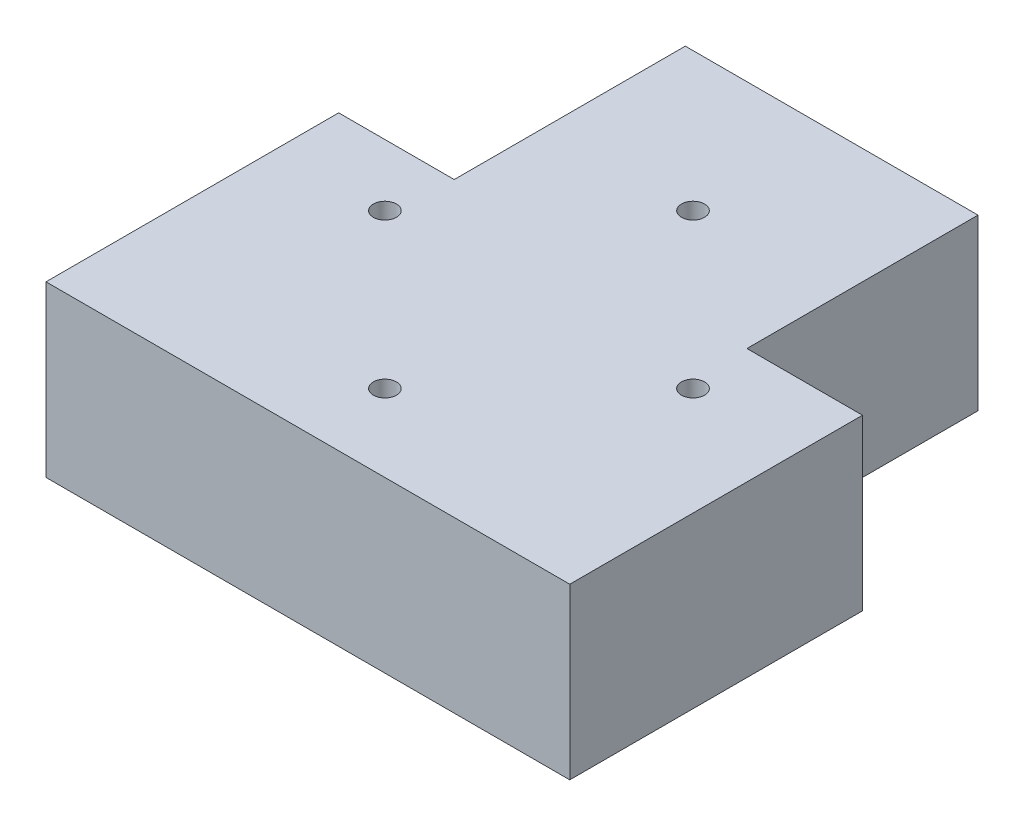
ISO-10303-21;
HEADER;
FILE_DESCRIPTION(('STEP AP214'),'2;1');
FILE_NAME('part.step','',(''),(''),'','','');
FILE_SCHEMA(('AUTOMOTIVE_DESIGN { 1 0 10303 214 1 1 1 1 }'));
ENDSEC;
DATA;
#1=APPLICATION_CONTEXT('core data for automotive mechanical design processes');
#2=APPLICATION_PROTOCOL_DEFINITION('international standard','automotive_design',2000,#1);
#3=PRODUCT_CONTEXT('',#1,'mechanical');
#4=PRODUCT('Part','Part','',(#3));
#5=PRODUCT_RELATED_PRODUCT_CATEGORY('part','',(#4));
#6=PRODUCT_DEFINITION_FORMATION('','',#4);
#7=PRODUCT_DEFINITION_CONTEXT('part definition',#1,'design');
#8=PRODUCT_DEFINITION('design','',#6,#7);
#9=PRODUCT_DEFINITION_SHAPE('','',#8);
#10=(LENGTH_UNIT() NAMED_UNIT(*) SI_UNIT(.MILLI.,.METRE.));
#11=(NAMED_UNIT(*) PLANE_ANGLE_UNIT() SI_UNIT($,.RADIAN.));
#12=(NAMED_UNIT(*) SI_UNIT($,.STERADIAN.) SOLID_ANGLE_UNIT());
#13=UNCERTAINTY_MEASURE_WITH_UNIT(LENGTH_MEASURE(1.E-05),#10,'distance_accuracy_value','');
#14=(GEOMETRIC_REPRESENTATION_CONTEXT(3) GLOBAL_UNCERTAINTY_ASSIGNED_CONTEXT((#13)) GLOBAL_UNIT_ASSIGNED_CONTEXT((#10,
#11,#12)) REPRESENTATION_CONTEXT('',''));
#15=CARTESIAN_POINT('',(0.,0.,0.));
#16=DIRECTION('',(0.,0.,1.));
#17=DIRECTION('',(1.,0.,0.));
#18=AXIS2_PLACEMENT_3D('',#15,#16,#17);
#19=CARTESIAN_POINT('',(-19.9999999999994,10.,5.6843418860808E-13));
#20=DIRECTION('',(0.,-1.,0.));
#21=DIRECTION('',(0.,0.,-1.));
#22=AXIS2_PLACEMENT_3D('',#19,#20,#21);
#23=CYLINDRICAL_SURFACE('',#22,1.5);
#24=CARTESIAN_POINT('',(-19.9999999999994,10.,5.6843418860808E-13));
#25=DIRECTION('',(0.,1.,0.));
#26=DIRECTION('',(0.,0.,1.));
#27=AXIS2_PLACEMENT_3D('',#24,#25,#26);
#28=CIRCLE('',#27,1.5);
#29=CARTESIAN_POINT('',(-19.9999999999994,10.,1.50000000000057));
#30=VERTEX_POINT('',#29);
#31=EDGE_CURVE('E182',#30,#30,#28,.T.);
#32=ORIENTED_EDGE('',*,*,#31,.T.);
#33=EDGE_LOOP('',(#32));
#34=FACE_BOUND('',#33,.T.);
#35=CARTESIAN_POINT('',(-19.9999999999994,7.,5.6843418860808E-13));
#36=DIRECTION('',(0.,-1.,0.));
#37=DIRECTION('',(0.,0.,-1.));
#38=AXIS2_PLACEMENT_3D('',#35,#36,#37);
#39=CIRCLE('',#38,1.5);
#40=CARTESIAN_POINT('',(-19.9999999999994,7.,-1.49999999999943));
#41=VERTEX_POINT('',#40);
#42=EDGE_CURVE('E45',#41,#41,#39,.T.);
#43=ORIENTED_EDGE('',*,*,#42,.T.);
#44=EDGE_LOOP('',(#43));
#45=FACE_BOUND('',#44,.T.);
#46=ADVANCED_FACE('F41',(#34,#45),#23,.F.);
#47=CARTESIAN_POINT('',(1.13196979001957E-12,10.,20.));
#48=DIRECTION('',(0.,-1.,0.));
#49=DIRECTION('',(0.,0.,-1.));
#50=AXIS2_PLACEMENT_3D('',#47,#48,#49);
#51=CYLINDRICAL_SURFACE('',#50,1.5);
#52=CARTESIAN_POINT('',(1.13196979001957E-12,10.,20.));
#53=DIRECTION('',(0.,1.,0.));
#54=DIRECTION('',(0.,0.,1.));
#55=AXIS2_PLACEMENT_3D('',#52,#53,#54);
#56=CIRCLE('',#55,1.5);
#57=CARTESIAN_POINT('',(1.13196979001957E-12,10.,21.5));
#58=VERTEX_POINT('',#57);
#59=EDGE_CURVE('E186',#58,#58,#56,.T.);
#60=ORIENTED_EDGE('',*,*,#59,.T.);
#61=EDGE_LOOP('',(#60));
#62=FACE_BOUND('',#61,.T.);
#63=CARTESIAN_POINT('',(1.13196979001957E-12,7.,20.));
#64=DIRECTION('',(0.,-1.,0.));
#65=DIRECTION('',(0.,0.,-1.));
#66=AXIS2_PLACEMENT_3D('',#63,#64,#65);
#67=CIRCLE('',#66,1.5);
#68=CARTESIAN_POINT('',(1.13196979001957E-12,7.,18.5));
#69=VERTEX_POINT('',#68);
#70=EDGE_CURVE('E338',#69,#69,#67,.T.);
#71=ORIENTED_EDGE('',*,*,#70,.T.);
#72=EDGE_LOOP('',(#71));
#73=FACE_BOUND('',#72,.T.);
#74=ADVANCED_FACE('F364',(#62,#73),#51,.F.);
#75=CARTESIAN_POINT('',(20.0000000000006,10.,-5.65984895009786E-13));
#76=DIRECTION('',(0.,-1.,0.));
#77=DIRECTION('',(0.,0.,-1.));
#78=AXIS2_PLACEMENT_3D('',#75,#76,#77);
#79=CYLINDRICAL_SURFACE('',#78,1.5);
#80=CARTESIAN_POINT('',(20.0000000000006,10.,-5.65984895009786E-13));
#81=DIRECTION('',(0.,1.,0.));
#82=DIRECTION('',(0.,0.,1.));
#83=AXIS2_PLACEMENT_3D('',#80,#81,#82);
#84=CIRCLE('',#83,1.5);
#85=CARTESIAN_POINT('',(20.0000000000006,10.,1.49999999999943));
#86=VERTEX_POINT('',#85);
#87=EDGE_CURVE('E350',#86,#86,#84,.T.);
#88=ORIENTED_EDGE('',*,*,#87,.T.);
#89=EDGE_LOOP('',(#88));
#90=FACE_BOUND('',#89,.T.);
#91=CARTESIAN_POINT('',(20.0000000000006,7.,-5.65984895009786E-13));
#92=DIRECTION('',(0.,-1.,0.));
#93=DIRECTION('',(0.,0.,-1.));
#94=AXIS2_PLACEMENT_3D('',#91,#92,#93);
#95=CIRCLE('',#94,1.5);
#96=CARTESIAN_POINT('',(20.0000000000006,7.,-1.50000000000057));
#97=VERTEX_POINT('',#96);
#98=EDGE_CURVE('E334',#97,#97,#95,.T.);
#99=ORIENTED_EDGE('',*,*,#98,.T.);
#100=EDGE_LOOP('',(#99));
#101=FACE_BOUND('',#100,.T.);
#102=ADVANCED_FACE('F374',(#90,#101),#79,.F.);
#103=CARTESIAN_POINT('',(0.,10.,-20.));
#104=DIRECTION('',(0.,-1.,0.));
#105=DIRECTION('',(0.,0.,-1.));
#106=AXIS2_PLACEMENT_3D('',#103,#104,#105);
#107=CYLINDRICAL_SURFACE('',#106,1.5);
#108=CARTESIAN_POINT('',(0.,10.,-20.));
#109=DIRECTION('',(0.,1.,0.));
#110=DIRECTION('',(0.,0.,1.));
#111=AXIS2_PLACEMENT_3D('',#108,#109,#110);
#112=CIRCLE('',#111,1.5);
#113=CARTESIAN_POINT('',(0.,10.,-18.5));
#114=VERTEX_POINT('',#113);
#115=EDGE_CURVE('E345',#114,#114,#112,.T.);
#116=ORIENTED_EDGE('',*,*,#115,.T.);
#117=EDGE_LOOP('',(#116));
#118=FACE_BOUND('',#117,.T.);
#119=CARTESIAN_POINT('',(0.,7.,-20.));
#120=DIRECTION('',(0.,-1.,0.));
#121=DIRECTION('',(0.,0.,-1.));
#122=AXIS2_PLACEMENT_3D('',#119,#120,#121);
#123=CIRCLE('',#122,1.5);
#124=CARTESIAN_POINT('',(0.,7.,-21.5));
#125=VERTEX_POINT('',#124);
#126=EDGE_CURVE('E330',#125,#125,#123,.T.);
#127=ORIENTED_EDGE('',*,*,#126,.T.);
#128=EDGE_LOOP('',(#127));
#129=FACE_BOUND('',#128,.T.);
#130=ADVANCED_FACE('F377',(#118,#129),#107,.F.);
#131=CARTESIAN_POINT('',(34.,0.,30.));
#132=DIRECTION('',(1.,0.,0.));
#133=DIRECTION('',(0.,0.,-1.));
#134=AXIS2_PLACEMENT_3D('',#131,#132,#133);
#135=PLANE('',#134);
#136=DIRECTION('',(0.,1.,0.));
#137=VECTOR('',#136,1.);
#138=CARTESIAN_POINT('',(34.,-12.,-8.));
#139=LINE('',#138,#137);
#140=CARTESIAN_POINT('',(34.,-12.,-8.));
#141=VERTEX_POINT('',#140);
#142=CARTESIAN_POINT('',(34.,10.,-8.));
#143=VERTEX_POINT('',#142);
#144=EDGE_CURVE('E168',#141,#143,#139,.T.);
#145=ORIENTED_EDGE('',*,*,#144,.T.);
#146=DIRECTION('',(0.,0.,-1.));
#147=VECTOR('',#146,1.);
#148=CARTESIAN_POINT('',(34.,10.,-8.));
#149=LINE('',#148,#147);
#150=CARTESIAN_POINT('',(34.,10.,30.));
#151=VERTEX_POINT('',#150);
#152=EDGE_CURVE('E165',#151,#143,#149,.T.);
#153=ORIENTED_EDGE('',*,*,#152,.F.);
#154=DIRECTION('',(0.,1.,0.));
#155=VECTOR('',#154,1.);
#156=CARTESIAN_POINT('',(34.,0.,30.));
#157=LINE('',#156,#155);
#158=CARTESIAN_POINT('',(34.,-12.,30.));
#159=VERTEX_POINT('',#158);
#160=EDGE_CURVE('E11',#159,#151,#157,.T.);
#161=ORIENTED_EDGE('',*,*,#160,.F.);
#162=DIRECTION('',(0.,0.,1.));
#163=VECTOR('',#162,1.);
#164=CARTESIAN_POINT('',(34.,-12.,-8.));
#165=LINE('',#164,#163);
#166=EDGE_CURVE('E308',#141,#159,#165,.T.);
#167=ORIENTED_EDGE('',*,*,#166,.F.);
#168=EDGE_LOOP('',(#145,#153,#161,#167));
#169=FACE_BOUND('',#168,.T.);
#170=ADVANCED_FACE('F166',(#169),#135,.T.);
#171=CARTESIAN_POINT('',(-34.,0.,30.));
#172=DIRECTION('',(-1.,0.,0.));
#173=DIRECTION('',(0.,0.,1.));
#174=AXIS2_PLACEMENT_3D('',#171,#172,#173);
#175=PLANE('',#174);
#176=DIRECTION('',(0.,1.,0.));
#177=VECTOR('',#176,1.);
#178=CARTESIAN_POINT('',(-34.,0.,30.));
#179=LINE('',#178,#177);
#180=CARTESIAN_POINT('',(-34.,-12.,30.));
#181=VERTEX_POINT('',#180);
#182=CARTESIAN_POINT('',(-34.,10.,30.));
#183=VERTEX_POINT('',#182);
#184=EDGE_CURVE('E51',#181,#183,#179,.T.);
#185=ORIENTED_EDGE('',*,*,#184,.T.);
#186=DIRECTION('',(0.,0.,1.));
#187=VECTOR('',#186,1.);
#188=CARTESIAN_POINT('',(-34.,10.,30.));
#189=LINE('',#188,#187);
#190=CARTESIAN_POINT('',(-34.,10.,-8.));
#191=VERTEX_POINT('',#190);
#192=EDGE_CURVE('E180',#191,#183,#189,.T.);
#193=ORIENTED_EDGE('',*,*,#192,.F.);
#194=DIRECTION('',(0.,1.,0.));
#195=VECTOR('',#194,1.);
#196=CARTESIAN_POINT('',(-34.,-12.,-8.));
#197=LINE('',#196,#195);
#198=CARTESIAN_POINT('',(-34.,-12.,-8.));
#199=VERTEX_POINT('',#198);
#200=EDGE_CURVE('E325',#199,#191,#197,.T.);
#201=ORIENTED_EDGE('',*,*,#200,.F.);
#202=DIRECTION('',(0.,0.,-1.));
#203=VECTOR('',#202,1.);
#204=CARTESIAN_POINT('',(-34.,-12.,30.));
#205=LINE('',#204,#203);
#206=EDGE_CURVE('E290',#181,#199,#205,.T.);
#207=ORIENTED_EDGE('',*,*,#206,.F.);
#208=EDGE_LOOP('',(#185,#193,#201,#207));
#209=FACE_BOUND('',#208,.T.);
#210=ADVANCED_FACE('F43',(#209),#175,.T.);
#211=CARTESIAN_POINT('',(-34.,0.,30.));
#212=DIRECTION('',(0.,0.,1.));
#213=DIRECTION('',(1.,0.,0.));
#214=AXIS2_PLACEMENT_3D('',#211,#212,#213);
#215=PLANE('',#214);
#216=ORIENTED_EDGE('',*,*,#184,.F.);
#217=DIRECTION('',(-1.,0.,0.));
#218=VECTOR('',#217,1.);
#219=CARTESIAN_POINT('',(34.,-12.,30.));
#220=LINE('',#219,#218);
#221=EDGE_CURVE('E160',#159,#181,#220,.T.);
#222=ORIENTED_EDGE('',*,*,#221,.F.);
#223=ORIENTED_EDGE('',*,*,#160,.T.);
#224=DIRECTION('',(1.,0.,0.));
#225=VECTOR('',#224,1.);
#226=CARTESIAN_POINT('',(34.,10.,30.));
#227=LINE('',#226,#225);
#228=EDGE_CURVE('E158',#183,#151,#227,.T.);
#229=ORIENTED_EDGE('',*,*,#228,.F.);
#230=EDGE_LOOP('',(#216,#222,#223,#229));
#231=FACE_BOUND('',#230,.T.);
#232=ADVANCED_FACE('F156',(#231),#215,.T.);
#233=CARTESIAN_POINT('',(-49.1041901155319,0.,-38.));
#234=DIRECTION('',(0.,0.,1.));
#235=DIRECTION('',(1.,0.,0.));
#236=AXIS2_PLACEMENT_3D('',#233,#234,#235);
#237=PLANE('',#236);
#238=DIRECTION('',(0.,1.,0.));
#239=VECTOR('',#238,1.);
#240=CARTESIAN_POINT('',(-19.,-12.,-38.));
#241=LINE('',#240,#239);
#242=CARTESIAN_POINT('',(-19.,-12.,-38.));
#243=VERTEX_POINT('',#242);
#244=CARTESIAN_POINT('',(-19.,10.,-38.));
#245=VERTEX_POINT('',#244);
#246=EDGE_CURVE('E319',#243,#245,#241,.T.);
#247=ORIENTED_EDGE('',*,*,#246,.T.);
#248=DIRECTION('',(-1.,0.,0.));
#249=VECTOR('',#248,1.);
#250=CARTESIAN_POINT('',(-19.,10.,-38.));
#251=LINE('',#250,#249);
#252=CARTESIAN_POINT('',(19.,10.,-38.));
#253=VERTEX_POINT('',#252);
#254=EDGE_CURVE('E196',#253,#245,#251,.T.);
#255=ORIENTED_EDGE('',*,*,#254,.F.);
#256=DIRECTION('',(0.,1.,0.));
#257=VECTOR('',#256,1.);
#258=CARTESIAN_POINT('',(19.,-12.,-38.));
#259=LINE('',#258,#257);
#260=CARTESIAN_POINT('',(19.,-12.,-38.));
#261=VERTEX_POINT('',#260);
#262=EDGE_CURVE('E316',#261,#253,#259,.T.);
#263=ORIENTED_EDGE('',*,*,#262,.F.);
#264=DIRECTION('',(1.,0.,0.));
#265=VECTOR('',#264,1.);
#266=CARTESIAN_POINT('',(-19.,-12.,-38.));
#267=LINE('',#266,#265);
#268=EDGE_CURVE('E299',#243,#261,#267,.T.);
#269=ORIENTED_EDGE('',*,*,#268,.F.);
#270=EDGE_LOOP('',(#247,#255,#263,#269));
#271=FACE_BOUND('',#270,.T.);
#272=ADVANCED_FACE('F425',(#271),#237,.F.);
#273=CARTESIAN_POINT('',(56.,3.,-38.));
#274=DIRECTION('',(0.,1.,0.));
#275=DIRECTION('',(0.,0.,1.));
#276=AXIS2_PLACEMENT_3D('',#273,#274,#275);
#277=PLANE('',#276);
#278=CARTESIAN_POINT('',(1.13196979001957E-12,3.,20.));
#279=DIRECTION('',(0.,-1.,0.));
#280=DIRECTION('',(0.,0.,-1.));
#281=AXIS2_PLACEMENT_3D('',#278,#279,#280);
#282=CIRCLE('',#281,2.75);
#283=CARTESIAN_POINT('',(1.13196979001957E-12,3.,17.25));
#284=VERTEX_POINT('',#283);
#285=EDGE_CURVE('E392',#284,#284,#282,.T.);
#286=ORIENTED_EDGE('',*,*,#285,.F.);
#287=EDGE_LOOP('',(#286));
#288=FACE_BOUND('',#287,.T.);
#289=CARTESIAN_POINT('',(20.0000000000006,3.,-5.65984895009786E-13));
#290=DIRECTION('',(0.,-1.,0.));
#291=DIRECTION('',(0.,0.,-1.));
#292=AXIS2_PLACEMENT_3D('',#289,#290,#291);
#293=CIRCLE('',#292,2.75);
#294=CARTESIAN_POINT('',(20.0000000000006,3.,-2.75000000000056));
#295=VERTEX_POINT('',#294);
#296=EDGE_CURVE('E393',#295,#295,#293,.T.);
#297=ORIENTED_EDGE('',*,*,#296,.F.);
#298=EDGE_LOOP('',(#297));
#299=FACE_BOUND('',#298,.T.);
#300=CARTESIAN_POINT('',(0.,3.,-20.));
#301=DIRECTION('',(0.,-1.,0.));
#302=DIRECTION('',(0.,0.,-1.));
#303=AXIS2_PLACEMENT_3D('',#300,#301,#302);
#304=CIRCLE('',#303,2.75);
#305=CARTESIAN_POINT('',(0.,3.,-22.75));
#306=VERTEX_POINT('',#305);
#307=EDGE_CURVE('E407',#306,#306,#304,.T.);
#308=ORIENTED_EDGE('',*,*,#307,.F.);
#309=EDGE_LOOP('',(#308));
#310=FACE_BOUND('',#309,.T.);
#311=CARTESIAN_POINT('',(-19.9999999999994,3.,5.6843418860808E-13));
#312=DIRECTION('',(0.,-1.,0.));
#313=DIRECTION('',(0.,0.,-1.));
#314=AXIS2_PLACEMENT_3D('',#311,#312,#313);
#315=CIRCLE('',#314,2.75);
#316=CARTESIAN_POINT('',(-19.9999999999994,3.,-2.74999999999943));
#317=VERTEX_POINT('',#316);
#318=EDGE_CURVE('E358',#317,#317,#315,.T.);
#319=ORIENTED_EDGE('',*,*,#318,.F.);
#320=EDGE_LOOP('',(#319));
#321=FACE_BOUND('',#320,.T.);
#322=DIRECTION('',(0.,0.,1.));
#323=VECTOR('',#322,1.);
#324=CARTESIAN_POINT('',(30.,3.,-4.));
#325=LINE('',#324,#323);
#326=CARTESIAN_POINT('',(30.,3.,-4.));
#327=VERTEX_POINT('',#326);
#328=CARTESIAN_POINT('',(30.,3.,26.));
#329=VERTEX_POINT('',#328);
#330=EDGE_CURVE('E214',#327,#329,#325,.T.);
#331=ORIENTED_EDGE('',*,*,#330,.T.);
#332=DIRECTION('',(-1.,0.,0.));
#333=VECTOR('',#332,1.);
#334=CARTESIAN_POINT('',(30.,3.,26.));
#335=LINE('',#334,#333);
#336=CARTESIAN_POINT('',(-30.,3.,26.));
#337=VERTEX_POINT('',#336);
#338=EDGE_CURVE('E209',#329,#337,#335,.T.);
#339=ORIENTED_EDGE('',*,*,#338,.T.);
#340=DIRECTION('',(0.,0.,-1.));
#341=VECTOR('',#340,1.);
#342=CARTESIAN_POINT('',(-30.,3.,26.));
#343=LINE('',#342,#341);
#344=CARTESIAN_POINT('',(-30.,3.,-3.99999999999999));
#345=VERTEX_POINT('',#344);
#346=EDGE_CURVE('E238',#337,#345,#343,.T.);
#347=ORIENTED_EDGE('',*,*,#346,.T.);
#348=DIRECTION('',(1.,0.,0.));
#349=VECTOR('',#348,1.);
#350=CARTESIAN_POINT('',(-30.,3.,-3.99999999999999));
#351=LINE('',#350,#349);
#352=CARTESIAN_POINT('',(-15.,3.,-3.99999999999999));
#353=VERTEX_POINT('',#352);
#354=EDGE_CURVE('E242',#345,#353,#351,.T.);
#355=ORIENTED_EDGE('',*,*,#354,.T.);
#356=DIRECTION('',(0.,0.,-1.));
#357=VECTOR('',#356,1.);
#358=CARTESIAN_POINT('',(-15.,3.,-3.99999999999999));
#359=LINE('',#358,#357);
#360=CARTESIAN_POINT('',(-15.,3.,-34.));
#361=VERTEX_POINT('',#360);
#362=EDGE_CURVE('E246',#353,#361,#359,.T.);
#363=ORIENTED_EDGE('',*,*,#362,.T.);
#364=DIRECTION('',(1.,0.,0.));
#365=VECTOR('',#364,1.);
#366=CARTESIAN_POINT('',(-15.,3.,-34.));
#367=LINE('',#366,#365);
#368=CARTESIAN_POINT('',(15.,3.,-34.));
#369=VERTEX_POINT('',#368);
#370=EDGE_CURVE('E250',#361,#369,#367,.T.);
#371=ORIENTED_EDGE('',*,*,#370,.T.);
#372=DIRECTION('',(0.,0.,1.));
#373=VECTOR('',#372,1.);
#374=CARTESIAN_POINT('',(15.,3.,-34.));
#375=LINE('',#374,#373);
#376=CARTESIAN_POINT('',(15.,3.,-4.));
#377=VERTEX_POINT('',#376);
#378=EDGE_CURVE('E254',#369,#377,#375,.T.);
#379=ORIENTED_EDGE('',*,*,#378,.T.);
#380=DIRECTION('',(1.,0.,0.));
#381=VECTOR('',#380,1.);
#382=CARTESIAN_POINT('',(15.,3.,-4.));
#383=LINE('',#382,#381);
#384=EDGE_CURVE('E258',#377,#327,#383,.T.);
#385=ORIENTED_EDGE('',*,*,#384,.T.);
#386=EDGE_LOOP('',(#331,#339,#347,#355,#363,#371,#379,#385));
#387=FACE_BOUND('',#386,.T.);
#388=ADVANCED_FACE('F421',(#288,#299,#310,#321,#387),#277,.F.);
#389=CARTESIAN_POINT('',(0.,-12.,0.));
#390=DIRECTION('',(0.,-1.,0.));
#391=DIRECTION('',(0.,0.,-1.));
#392=AXIS2_PLACEMENT_3D('',#389,#390,#391);
#393=PLANE('',#392);
#394=ORIENTED_EDGE('',*,*,#221,.T.);
#395=ORIENTED_EDGE('',*,*,#206,.T.);
#396=DIRECTION('',(1.,0.,0.));
#397=VECTOR('',#396,1.);
#398=CARTESIAN_POINT('',(-34.,-12.,-8.));
#399=LINE('',#398,#397);
#400=CARTESIAN_POINT('',(-19.,-12.,-8.));
#401=VERTEX_POINT('',#400);
#402=EDGE_CURVE('E293',#199,#401,#399,.T.);
#403=ORIENTED_EDGE('',*,*,#402,.T.);
#404=DIRECTION('',(0.,0.,-1.));
#405=VECTOR('',#404,1.);
#406=CARTESIAN_POINT('',(-19.,-12.,-8.));
#407=LINE('',#406,#405);
#408=EDGE_CURVE('E296',#401,#243,#407,.T.);
#409=ORIENTED_EDGE('',*,*,#408,.T.);
#410=ORIENTED_EDGE('',*,*,#268,.T.);
#411=DIRECTION('',(0.,0.,1.));
#412=VECTOR('',#411,1.);
#413=CARTESIAN_POINT('',(19.,-12.,-38.));
#414=LINE('',#413,#412);
#415=CARTESIAN_POINT('',(19.,-12.,-8.));
#416=VERTEX_POINT('',#415);
#417=EDGE_CURVE('E302',#261,#416,#414,.T.);
#418=ORIENTED_EDGE('',*,*,#417,.T.);
#419=DIRECTION('',(1.,0.,0.));
#420=VECTOR('',#419,1.);
#421=CARTESIAN_POINT('',(19.,-12.,-8.));
#422=LINE('',#421,#420);
#423=EDGE_CURVE('E305',#416,#141,#422,.T.);
#424=ORIENTED_EDGE('',*,*,#423,.T.);
#425=ORIENTED_EDGE('',*,*,#166,.T.);
#426=EDGE_LOOP('',(#394,#395,#403,#409,#410,#418,#424,#425));
#427=FACE_BOUND('',#426,.T.);
#428=DIRECTION('',(0.,0.,-1.));
#429=VECTOR('',#428,1.);
#430=CARTESIAN_POINT('',(-30.,-12.,26.));
#431=LINE('',#430,#429);
#432=CARTESIAN_POINT('',(-30.,-12.,26.));
#433=VERTEX_POINT('',#432);
#434=CARTESIAN_POINT('',(-30.,-12.,-3.99999999999999));
#435=VERTEX_POINT('',#434);
#436=EDGE_CURVE('E213',#433,#435,#431,.T.);
#437=ORIENTED_EDGE('',*,*,#436,.F.);
#438=DIRECTION('',(-1.,0.,0.));
#439=VECTOR('',#438,1.);
#440=CARTESIAN_POINT('',(30.,-12.,26.));
#441=LINE('',#440,#439);
#442=CARTESIAN_POINT('',(30.,-12.,26.));
#443=VERTEX_POINT('',#442);
#444=EDGE_CURVE('E210',#443,#433,#441,.T.);
#445=ORIENTED_EDGE('',*,*,#444,.F.);
#446=DIRECTION('',(0.,0.,1.));
#447=VECTOR('',#446,1.);
#448=CARTESIAN_POINT('',(30.,-12.,-4.));
#449=LINE('',#448,#447);
#450=CARTESIAN_POINT('',(30.,-12.,-4.));
#451=VERTEX_POINT('',#450);
#452=EDGE_CURVE('E232',#451,#443,#449,.T.);
#453=ORIENTED_EDGE('',*,*,#452,.F.);
#454=DIRECTION('',(1.,0.,0.));
#455=VECTOR('',#454,1.);
#456=CARTESIAN_POINT('',(15.,-12.,-4.));
#457=LINE('',#456,#455);
#458=CARTESIAN_POINT('',(15.,-12.,-4.));
#459=VERTEX_POINT('',#458);
#460=EDGE_CURVE('E229',#459,#451,#457,.T.);
#461=ORIENTED_EDGE('',*,*,#460,.F.);
#462=DIRECTION('',(0.,0.,1.));
#463=VECTOR('',#462,1.);
#464=CARTESIAN_POINT('',(15.,-12.,-34.));
#465=LINE('',#464,#463);
#466=CARTESIAN_POINT('',(15.,-12.,-34.));
#467=VERTEX_POINT('',#466);
#468=EDGE_CURVE('E226',#467,#459,#465,.T.);
#469=ORIENTED_EDGE('',*,*,#468,.F.);
#470=DIRECTION('',(1.,0.,0.));
#471=VECTOR('',#470,1.);
#472=CARTESIAN_POINT('',(-15.,-12.,-34.));
#473=LINE('',#472,#471);
#474=CARTESIAN_POINT('',(-15.,-12.,-34.));
#475=VERTEX_POINT('',#474);
#476=EDGE_CURVE('E223',#475,#467,#473,.T.);
#477=ORIENTED_EDGE('',*,*,#476,.F.);
#478=DIRECTION('',(0.,0.,-1.));
#479=VECTOR('',#478,1.);
#480=CARTESIAN_POINT('',(-15.,-12.,-3.99999999999999));
#481=LINE('',#480,#479);
#482=CARTESIAN_POINT('',(-15.,-12.,-3.99999999999999));
#483=VERTEX_POINT('',#482);
#484=EDGE_CURVE('E220',#483,#475,#481,.T.);
#485=ORIENTED_EDGE('',*,*,#484,.F.);
#486=DIRECTION('',(1.,0.,0.));
#487=VECTOR('',#486,1.);
#488=CARTESIAN_POINT('',(-30.,-12.,-3.99999999999999));
#489=LINE('',#488,#487);
#490=EDGE_CURVE('E217',#435,#483,#489,.T.);
#491=ORIENTED_EDGE('',*,*,#490,.F.);
#492=EDGE_LOOP('',(#437,#445,#453,#461,#469,#477,#485,#491));
#493=FACE_BOUND('',#492,.T.);
#494=ADVANCED_FACE('F424',(#427,#493),#393,.T.);
#495=CARTESIAN_POINT('',(-34.,-12.,-8.));
#496=DIRECTION('',(0.,0.,1.));
#497=DIRECTION('',(1.,0.,0.));
#498=AXIS2_PLACEMENT_3D('',#495,#496,#497);
#499=PLANE('',#498);
#500=ORIENTED_EDGE('',*,*,#200,.T.);
#501=DIRECTION('',(-1.,0.,0.));
#502=VECTOR('',#501,1.);
#503=CARTESIAN_POINT('',(-34.,10.,-8.));
#504=LINE('',#503,#502);
#505=CARTESIAN_POINT('',(-19.,10.,-8.));
#506=VERTEX_POINT('',#505);
#507=EDGE_CURVE('E204',#506,#191,#504,.T.);
#508=ORIENTED_EDGE('',*,*,#507,.F.);
#509=DIRECTION('',(0.,1.,0.));
#510=VECTOR('',#509,1.);
#511=CARTESIAN_POINT('',(-19.,-12.,-8.));
#512=LINE('',#511,#510);
#513=EDGE_CURVE('E322',#401,#506,#512,.T.);
#514=ORIENTED_EDGE('',*,*,#513,.F.);
#515=ORIENTED_EDGE('',*,*,#402,.F.);
#516=EDGE_LOOP('',(#500,#508,#514,#515));
#517=FACE_BOUND('',#516,.T.);
#518=ADVANCED_FACE('F587',(#517),#499,.F.);
#519=CARTESIAN_POINT('',(-19.,-12.,-8.));
#520=DIRECTION('',(1.,0.,0.));
#521=DIRECTION('',(0.,0.,-1.));
#522=AXIS2_PLACEMENT_3D('',#519,#520,#521);
#523=PLANE('',#522);
#524=ORIENTED_EDGE('',*,*,#513,.T.);
#525=DIRECTION('',(0.,0.,1.));
#526=VECTOR('',#525,1.);
#527=CARTESIAN_POINT('',(-19.,10.,-8.));
#528=LINE('',#527,#526);
#529=EDGE_CURVE('E200',#245,#506,#528,.T.);
#530=ORIENTED_EDGE('',*,*,#529,.F.);
#531=ORIENTED_EDGE('',*,*,#246,.F.);
#532=ORIENTED_EDGE('',*,*,#408,.F.);
#533=EDGE_LOOP('',(#524,#530,#531,#532));
#534=FACE_BOUND('',#533,.T.);
#535=ADVANCED_FACE('F574',(#534),#523,.F.);
#536=CARTESIAN_POINT('',(19.,-12.,-38.));
#537=DIRECTION('',(-1.,0.,0.));
#538=DIRECTION('',(0.,0.,1.));
#539=AXIS2_PLACEMENT_3D('',#536,#537,#538);
#540=PLANE('',#539);
#541=ORIENTED_EDGE('',*,*,#262,.T.);
#542=DIRECTION('',(0.,0.,-1.));
#543=VECTOR('',#542,1.);
#544=CARTESIAN_POINT('',(19.,10.,-38.));
#545=LINE('',#544,#543);
#546=CARTESIAN_POINT('',(19.,10.,-8.));
#547=VERTEX_POINT('',#546);
#548=EDGE_CURVE('E192',#547,#253,#545,.T.);
#549=ORIENTED_EDGE('',*,*,#548,.F.);
#550=DIRECTION('',(0.,1.,0.));
#551=VECTOR('',#550,1.);
#552=CARTESIAN_POINT('',(19.,-12.,-8.));
#553=LINE('',#552,#551);
#554=EDGE_CURVE('E313',#416,#547,#553,.T.);
#555=ORIENTED_EDGE('',*,*,#554,.F.);
#556=ORIENTED_EDGE('',*,*,#417,.F.);
#557=EDGE_LOOP('',(#541,#549,#555,#556));
#558=FACE_BOUND('',#557,.T.);
#559=ADVANCED_FACE('F560',(#558),#540,.F.);
#560=CARTESIAN_POINT('',(19.,-12.,-8.));
#561=DIRECTION('',(0.,0.,1.));
#562=DIRECTION('',(1.,0.,0.));
#563=AXIS2_PLACEMENT_3D('',#560,#561,#562);
#564=PLANE('',#563);
#565=ORIENTED_EDGE('',*,*,#554,.T.);
#566=DIRECTION('',(-1.,0.,0.));
#567=VECTOR('',#566,1.);
#568=CARTESIAN_POINT('',(19.,10.,-8.));
#569=LINE('',#568,#567);
#570=EDGE_CURVE('E173',#143,#547,#569,.T.);
#571=ORIENTED_EDGE('',*,*,#570,.F.);
#572=ORIENTED_EDGE('',*,*,#144,.F.);
#573=ORIENTED_EDGE('',*,*,#423,.F.);
#574=EDGE_LOOP('',(#565,#571,#572,#573));
#575=FACE_BOUND('',#574,.T.);
#576=ADVANCED_FACE('F553',(#575),#564,.F.);
#577=CARTESIAN_POINT('',(30.,-12.,26.));
#578=DIRECTION('',(0.,0.,-1.));
#579=DIRECTION('',(-1.,0.,0.));
#580=AXIS2_PLACEMENT_3D('',#577,#578,#579);
#581=PLANE('',#580);
#582=ORIENTED_EDGE('',*,*,#338,.F.);
#583=DIRECTION('',(0.,1.,0.));
#584=VECTOR('',#583,1.);
#585=CARTESIAN_POINT('',(30.,-12.,26.));
#586=LINE('',#585,#584);
#587=EDGE_CURVE('E59',#443,#329,#586,.T.);
#588=ORIENTED_EDGE('',*,*,#587,.F.);
#589=ORIENTED_EDGE('',*,*,#444,.T.);
#590=DIRECTION('',(0.,1.,0.));
#591=VECTOR('',#590,1.);
#592=CARTESIAN_POINT('',(-30.,-12.,26.));
#593=LINE('',#592,#591);
#594=EDGE_CURVE('E284',#433,#337,#593,.T.);
#595=ORIENTED_EDGE('',*,*,#594,.T.);
#596=EDGE_LOOP('',(#582,#588,#589,#595));
#597=FACE_BOUND('',#596,.T.);
#598=ADVANCED_FACE('F559',(#597),#581,.T.);
#599=CARTESIAN_POINT('',(-30.,-12.,26.));
#600=DIRECTION('',(1.,0.,0.));
#601=DIRECTION('',(0.,0.,-1.));
#602=AXIS2_PLACEMENT_3D('',#599,#600,#601);
#603=PLANE('',#602);
#604=ORIENTED_EDGE('',*,*,#346,.F.);
#605=ORIENTED_EDGE('',*,*,#594,.F.);
#606=ORIENTED_EDGE('',*,*,#436,.T.);
#607=DIRECTION('',(0.,1.,0.));
#608=VECTOR('',#607,1.);
#609=CARTESIAN_POINT('',(-30.,-12.,-3.99999999999999));
#610=LINE('',#609,#608);
#611=EDGE_CURVE('E281',#435,#345,#610,.T.);
#612=ORIENTED_EDGE('',*,*,#611,.T.);
#613=EDGE_LOOP('',(#604,#605,#606,#612));
#614=FACE_BOUND('',#613,.T.);
#615=ADVANCED_FACE('F696',(#614),#603,.T.);
#616=CARTESIAN_POINT('',(-30.,-12.,-3.99999999999999));
#617=DIRECTION('',(0.,0.,1.));
#618=DIRECTION('',(1.,0.,0.));
#619=AXIS2_PLACEMENT_3D('',#616,#617,#618);
#620=PLANE('',#619);
#621=ORIENTED_EDGE('',*,*,#354,.F.);
#622=ORIENTED_EDGE('',*,*,#611,.F.);
#623=ORIENTED_EDGE('',*,*,#490,.T.);
#624=DIRECTION('',(0.,1.,0.));
#625=VECTOR('',#624,1.);
#626=CARTESIAN_POINT('',(-15.,-12.,-3.99999999999999));
#627=LINE('',#626,#625);
#628=EDGE_CURVE('E278',#483,#353,#627,.T.);
#629=ORIENTED_EDGE('',*,*,#628,.T.);
#630=EDGE_LOOP('',(#621,#622,#623,#629));
#631=FACE_BOUND('',#630,.T.);
#632=ADVANCED_FACE('F686',(#631),#620,.T.);
#633=CARTESIAN_POINT('',(-15.,-12.,-3.99999999999999));
#634=DIRECTION('',(1.,0.,0.));
#635=DIRECTION('',(0.,0.,-1.));
#636=AXIS2_PLACEMENT_3D('',#633,#634,#635);
#637=PLANE('',#636);
#638=ORIENTED_EDGE('',*,*,#362,.F.);
#639=ORIENTED_EDGE('',*,*,#628,.F.);
#640=ORIENTED_EDGE('',*,*,#484,.T.);
#641=DIRECTION('',(0.,1.,0.));
#642=VECTOR('',#641,1.);
#643=CARTESIAN_POINT('',(-15.,-12.,-34.));
#644=LINE('',#643,#642);
#645=EDGE_CURVE('E275',#475,#361,#644,.T.);
#646=ORIENTED_EDGE('',*,*,#645,.T.);
#647=EDGE_LOOP('',(#638,#639,#640,#646));
#648=FACE_BOUND('',#647,.T.);
#649=ADVANCED_FACE('F676',(#648),#637,.T.);
#650=CARTESIAN_POINT('',(-15.,-12.,-34.));
#651=DIRECTION('',(0.,0.,1.));
#652=DIRECTION('',(1.,0.,0.));
#653=AXIS2_PLACEMENT_3D('',#650,#651,#652);
#654=PLANE('',#653);
#655=ORIENTED_EDGE('',*,*,#370,.F.);
#656=ORIENTED_EDGE('',*,*,#645,.F.);
#657=ORIENTED_EDGE('',*,*,#476,.T.);
#658=DIRECTION('',(0.,1.,0.));
#659=VECTOR('',#658,1.);
#660=CARTESIAN_POINT('',(15.,-12.,-34.));
#661=LINE('',#660,#659);
#662=EDGE_CURVE('E272',#467,#369,#661,.T.);
#663=ORIENTED_EDGE('',*,*,#662,.T.);
#664=EDGE_LOOP('',(#655,#656,#657,#663));
#665=FACE_BOUND('',#664,.T.);
#666=ADVANCED_FACE('F666',(#665),#654,.T.);
#667=CARTESIAN_POINT('',(15.,-12.,-34.));
#668=DIRECTION('',(-1.,0.,0.));
#669=DIRECTION('',(0.,0.,1.));
#670=AXIS2_PLACEMENT_3D('',#667,#668,#669);
#671=PLANE('',#670);
#672=ORIENTED_EDGE('',*,*,#378,.F.);
#673=ORIENTED_EDGE('',*,*,#662,.F.);
#674=ORIENTED_EDGE('',*,*,#468,.T.);
#675=DIRECTION('',(0.,1.,0.));
#676=VECTOR('',#675,1.);
#677=CARTESIAN_POINT('',(15.,-12.,-4.));
#678=LINE('',#677,#676);
#679=EDGE_CURVE('E269',#459,#377,#678,.T.);
#680=ORIENTED_EDGE('',*,*,#679,.T.);
#681=EDGE_LOOP('',(#672,#673,#674,#680));
#682=FACE_BOUND('',#681,.T.);
#683=ADVANCED_FACE('F435',(#682),#671,.T.);
#684=CARTESIAN_POINT('',(15.,-12.,-4.));
#685=DIRECTION('',(0.,0.,1.));
#686=DIRECTION('',(1.,0.,0.));
#687=AXIS2_PLACEMENT_3D('',#684,#685,#686);
#688=PLANE('',#687);
#689=ORIENTED_EDGE('',*,*,#384,.F.);
#690=ORIENTED_EDGE('',*,*,#679,.F.);
#691=ORIENTED_EDGE('',*,*,#460,.T.);
#692=DIRECTION('',(0.,1.,0.));
#693=VECTOR('',#692,1.);
#694=CARTESIAN_POINT('',(30.,-12.,-4.));
#695=LINE('',#694,#693);
#696=EDGE_CURVE('E64',#451,#327,#695,.T.);
#697=ORIENTED_EDGE('',*,*,#696,.T.);
#698=EDGE_LOOP('',(#689,#690,#691,#697));
#699=FACE_BOUND('',#698,.T.);
#700=ADVANCED_FACE('F430',(#699),#688,.T.);
#701=CARTESIAN_POINT('',(30.,-12.,-4.));
#702=DIRECTION('',(-1.,0.,0.));
#703=DIRECTION('',(0.,0.,1.));
#704=AXIS2_PLACEMENT_3D('',#701,#702,#703);
#705=PLANE('',#704);
#706=ORIENTED_EDGE('',*,*,#330,.F.);
#707=ORIENTED_EDGE('',*,*,#696,.F.);
#708=ORIENTED_EDGE('',*,*,#452,.T.);
#709=ORIENTED_EDGE('',*,*,#587,.T.);
#710=EDGE_LOOP('',(#706,#707,#708,#709));
#711=FACE_BOUND('',#710,.T.);
#712=ADVANCED_FACE('F369',(#711),#705,.T.);
#713=CARTESIAN_POINT('',(0.,10.,0.));
#714=DIRECTION('',(0.,-1.,0.));
#715=DIRECTION('',(0.,0.,-1.));
#716=AXIS2_PLACEMENT_3D('',#713,#714,#715);
#717=PLANE('',#716);
#718=ORIENTED_EDGE('',*,*,#228,.T.);
#719=ORIENTED_EDGE('',*,*,#152,.T.);
#720=ORIENTED_EDGE('',*,*,#570,.T.);
#721=ORIENTED_EDGE('',*,*,#548,.T.);
#722=ORIENTED_EDGE('',*,*,#254,.T.);
#723=ORIENTED_EDGE('',*,*,#529,.T.);
#724=ORIENTED_EDGE('',*,*,#507,.T.);
#725=ORIENTED_EDGE('',*,*,#192,.T.);
#726=EDGE_LOOP('',(#718,#719,#720,#721,#722,#723,#724,#725));
#727=FACE_BOUND('',#726,.T.);
#728=ORIENTED_EDGE('',*,*,#31,.F.);
#729=EDGE_LOOP('',(#728));
#730=FACE_BOUND('',#729,.T.);
#731=ORIENTED_EDGE('',*,*,#59,.F.);
#732=EDGE_LOOP('',(#731));
#733=FACE_BOUND('',#732,.T.);
#734=ORIENTED_EDGE('',*,*,#87,.F.);
#735=EDGE_LOOP('',(#734));
#736=FACE_BOUND('',#735,.T.);
#737=ORIENTED_EDGE('',*,*,#115,.F.);
#738=EDGE_LOOP('',(#737));
#739=FACE_BOUND('',#738,.T.);
#740=ADVANCED_FACE('F176',(#727,#730,#733,#736,#739),#717,.F.);
#741=CARTESIAN_POINT('',(0.,7.,-20.));
#742=DIRECTION('',(0.,-1.,0.));
#743=DIRECTION('',(0.,0.,-1.));
#744=AXIS2_PLACEMENT_3D('',#741,#742,#743);
#745=CYLINDRICAL_SURFACE('',#744,2.75);
#746=CARTESIAN_POINT('',(0.,7.,-20.));
#747=DIRECTION('',(0.,-1.,0.));
#748=DIRECTION('',(0.,0.,-1.));
#749=AXIS2_PLACEMENT_3D('',#746,#747,#748);
#750=CIRCLE('',#749,2.75);
#751=CARTESIAN_POINT('',(0.,7.,-22.75));
#752=VERTEX_POINT('',#751);
#753=EDGE_CURVE('E400',#752,#752,#750,.T.);
#754=ORIENTED_EDGE('',*,*,#753,.F.);
#755=EDGE_LOOP('',(#754));
#756=FACE_BOUND('',#755,.T.);
#757=ORIENTED_EDGE('',*,*,#307,.T.);
#758=EDGE_LOOP('',(#757));
#759=FACE_BOUND('',#758,.T.);
#760=ADVANCED_FACE('F368',(#756,#759),#745,.F.);
#761=CARTESIAN_POINT('',(0.,7.,-20.));
#762=DIRECTION('',(0.,-1.,0.));
#763=DIRECTION('',(0.,0.,-1.));
#764=AXIS2_PLACEMENT_3D('',#761,#762,#763);
#765=PLANE('',#764);
#766=ORIENTED_EDGE('',*,*,#126,.F.);
#767=EDGE_LOOP('',(#766));
#768=FACE_BOUND('',#767,.T.);
#769=ORIENTED_EDGE('',*,*,#753,.T.);
#770=EDGE_LOOP('',(#769));
#771=FACE_BOUND('',#770,.T.);
#772=ADVANCED_FACE('F458',(#768,#771),#765,.T.);
#773=CARTESIAN_POINT('',(20.0000000000006,7.,-5.65984895009786E-13));
#774=DIRECTION('',(0.,-1.,0.));
#775=DIRECTION('',(0.,0.,-1.));
#776=AXIS2_PLACEMENT_3D('',#773,#774,#775);
#777=CYLINDRICAL_SURFACE('',#776,2.75);
#778=CARTESIAN_POINT('',(20.0000000000006,7.,-5.65984895009786E-13));
#779=DIRECTION('',(0.,-1.,0.));
#780=DIRECTION('',(0.,0.,-1.));
#781=AXIS2_PLACEMENT_3D('',#778,#779,#780);
#782=CIRCLE('',#781,2.75);
#783=CARTESIAN_POINT('',(20.0000000000006,7.,-2.75000000000056));
#784=VERTEX_POINT('',#783);
#785=EDGE_CURVE('E389',#784,#784,#782,.T.);
#786=ORIENTED_EDGE('',*,*,#785,.F.);
#787=EDGE_LOOP('',(#786));
#788=FACE_BOUND('',#787,.T.);
#789=ORIENTED_EDGE('',*,*,#296,.T.);
#790=EDGE_LOOP('',(#789));
#791=FACE_BOUND('',#790,.T.);
#792=ADVANCED_FACE('F385',(#788,#791),#777,.F.);
#793=CARTESIAN_POINT('',(20.0000000000006,7.,-5.65984895009786E-13));
#794=DIRECTION('',(0.,-1.,0.));
#795=DIRECTION('',(0.,0.,-1.));
#796=AXIS2_PLACEMENT_3D('',#793,#794,#795);
#797=PLANE('',#796);
#798=ORIENTED_EDGE('',*,*,#98,.F.);
#799=EDGE_LOOP('',(#798));
#800=FACE_BOUND('',#799,.T.);
#801=ORIENTED_EDGE('',*,*,#785,.T.);
#802=EDGE_LOOP('',(#801));
#803=FACE_BOUND('',#802,.T.);
#804=ADVANCED_FACE('F381',(#800,#803),#797,.T.);
#805=CARTESIAN_POINT('',(1.13196979001957E-12,7.,20.));
#806=DIRECTION('',(0.,-1.,0.));
#807=DIRECTION('',(0.,0.,-1.));
#808=AXIS2_PLACEMENT_3D('',#805,#806,#807);
#809=CYLINDRICAL_SURFACE('',#808,2.75);
#810=CARTESIAN_POINT('',(1.13196979001957E-12,7.,20.));
#811=DIRECTION('',(0.,-1.,0.));
#812=DIRECTION('',(0.,0.,-1.));
#813=AXIS2_PLACEMENT_3D('',#810,#811,#812);
#814=CIRCLE('',#813,2.75);
#815=CARTESIAN_POINT('',(1.13196979001957E-12,7.,17.25));
#816=VERTEX_POINT('',#815);
#817=EDGE_CURVE('E335',#816,#816,#814,.T.);
#818=ORIENTED_EDGE('',*,*,#817,.F.);
#819=EDGE_LOOP('',(#818));
#820=FACE_BOUND('',#819,.T.);
#821=ORIENTED_EDGE('',*,*,#285,.T.);
#822=EDGE_LOOP('',(#821));
#823=FACE_BOUND('',#822,.T.);
#824=ADVANCED_FACE('F384',(#820,#823),#809,.F.);
#825=CARTESIAN_POINT('',(1.13196979001957E-12,7.,20.));
#826=DIRECTION('',(0.,-1.,0.));
#827=DIRECTION('',(0.,0.,-1.));
#828=AXIS2_PLACEMENT_3D('',#825,#826,#827);
#829=PLANE('',#828);
#830=ORIENTED_EDGE('',*,*,#70,.F.);
#831=EDGE_LOOP('',(#830));
#832=FACE_BOUND('',#831,.T.);
#833=ORIENTED_EDGE('',*,*,#817,.T.);
#834=EDGE_LOOP('',(#833));
#835=FACE_BOUND('',#834,.T.);
#836=ADVANCED_FACE('F451',(#832,#835),#829,.T.);
#837=CARTESIAN_POINT('',(-19.9999999999994,7.,5.6843418860808E-13));
#838=DIRECTION('',(0.,-1.,0.));
#839=DIRECTION('',(0.,0.,-1.));
#840=AXIS2_PLACEMENT_3D('',#837,#838,#839);
#841=CYLINDRICAL_SURFACE('',#840,2.75);
#842=CARTESIAN_POINT('',(-19.9999999999994,7.,5.6843418860808E-13));
#843=DIRECTION('',(0.,-1.,0.));
#844=DIRECTION('',(0.,0.,-1.));
#845=AXIS2_PLACEMENT_3D('',#842,#843,#844);
#846=CIRCLE('',#845,2.75);
#847=CARTESIAN_POINT('',(-19.9999999999994,7.,-2.74999999999943));
#848=VERTEX_POINT('',#847);
#849=EDGE_CURVE('E410',#848,#848,#846,.T.);
#850=ORIENTED_EDGE('',*,*,#849,.F.);
#851=EDGE_LOOP('',(#850));
#852=FACE_BOUND('',#851,.T.);
#853=ORIENTED_EDGE('',*,*,#318,.T.);
#854=EDGE_LOOP('',(#853));
#855=FACE_BOUND('',#854,.T.);
#856=ADVANCED_FACE('F419',(#852,#855),#841,.F.);
#857=CARTESIAN_POINT('',(-19.9999999999994,7.,5.6843418860808E-13));
#858=DIRECTION('',(0.,-1.,0.));
#859=DIRECTION('',(0.,0.,-1.));
#860=AXIS2_PLACEMENT_3D('',#857,#858,#859);
#861=PLANE('',#860);
#862=ORIENTED_EDGE('',*,*,#42,.F.);
#863=EDGE_LOOP('',(#862));
#864=FACE_BOUND('',#863,.T.);
#865=ORIENTED_EDGE('',*,*,#849,.T.);
#866=EDGE_LOOP('',(#865));
#867=FACE_BOUND('',#866,.T.);
#868=ADVANCED_FACE('F450',(#864,#867),#861,.T.);
#869=CLOSED_SHELL('',(#46,#74,#102,#130,#170,#210,#232,#272,#388,#494,#518,#535,#559,#576,#598,
#615,#632,#649,#666,#683,#700,#712,#740,#760,#772,#792,#804,#824,#836,#856,#868));
#870=MANIFOLD_SOLID_BREP('B2',#869);
#871=ADVANCED_BREP_SHAPE_REPRESENTATION('',(#18,#870),#14);
#872=SHAPE_DEFINITION_REPRESENTATION(#9,#871);
ENDSEC;
END-ISO-10303-21;
